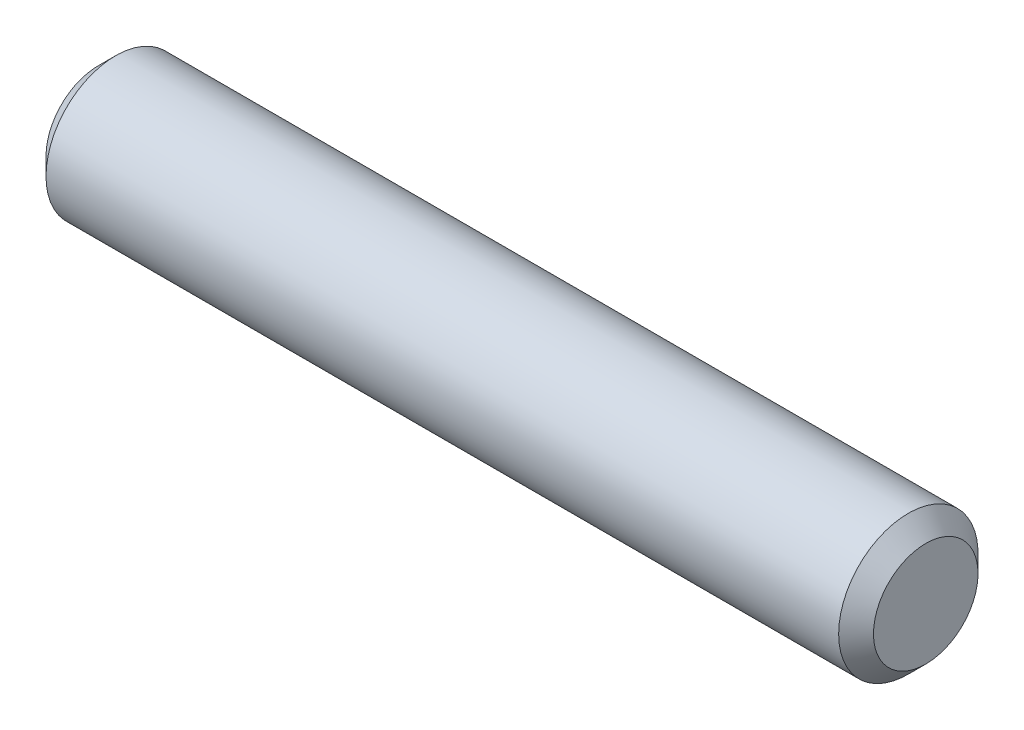
ISO-10303-21;
HEADER;
FILE_DESCRIPTION(('STEP AP214'),'2;1');
FILE_NAME('part.step','',(''),(''),'','','');
FILE_SCHEMA(('AUTOMOTIVE_DESIGN { 1 0 10303 214 1 1 1 1 }'));
ENDSEC;
DATA;
#1=APPLICATION_CONTEXT('core data for automotive mechanical design processes');
#2=APPLICATION_PROTOCOL_DEFINITION('international standard','automotive_design',2000,#1);
#3=PRODUCT_CONTEXT('',#1,'mechanical');
#4=PRODUCT('Part','Part','',(#3));
#5=PRODUCT_RELATED_PRODUCT_CATEGORY('part','',(#4));
#6=PRODUCT_DEFINITION_FORMATION('','',#4);
#7=PRODUCT_DEFINITION_CONTEXT('part definition',#1,'design');
#8=PRODUCT_DEFINITION('design','',#6,#7);
#9=PRODUCT_DEFINITION_SHAPE('','',#8);
#10=(LENGTH_UNIT() NAMED_UNIT(*) SI_UNIT(.MILLI.,.METRE.));
#11=(NAMED_UNIT(*) PLANE_ANGLE_UNIT() SI_UNIT($,.RADIAN.));
#12=(NAMED_UNIT(*) SI_UNIT($,.STERADIAN.) SOLID_ANGLE_UNIT());
#13=UNCERTAINTY_MEASURE_WITH_UNIT(LENGTH_MEASURE(1.E-05),#10,'distance_accuracy_value','');
#14=(GEOMETRIC_REPRESENTATION_CONTEXT(3) GLOBAL_UNCERTAINTY_ASSIGNED_CONTEXT((#13)) GLOBAL_UNIT_ASSIGNED_CONTEXT((#10,
#11,#12)) REPRESENTATION_CONTEXT('',''));
#15=CARTESIAN_POINT('',(0.,0.,0.));
#16=DIRECTION('',(0.,0.,1.));
#17=DIRECTION('',(1.,0.,0.));
#18=AXIS2_PLACEMENT_3D('',#15,#16,#17);
#19=CARTESIAN_POINT('',(-23.75,0.,0.));
#20=DIRECTION('',(1.,0.,0.));
#21=DIRECTION('',(0.,0.,-1.));
#22=AXIS2_PLACEMENT_3D('',#19,#20,#21);
#23=PLANE('',#22);
#24=CARTESIAN_POINT('',(-23.75,0.,0.));
#25=DIRECTION('',(-1.,0.,0.));
#26=DIRECTION('',(0.,0.,1.));
#27=AXIS2_PLACEMENT_3D('',#24,#25,#26);
#28=CIRCLE('',#27,3.);
#29=CARTESIAN_POINT('',(-23.75,0.,3.));
#30=VERTEX_POINT('',#29);
#31=EDGE_CURVE('E10',#30,#30,#28,.T.);
#32=ORIENTED_EDGE('',*,*,#31,.T.);
#33=EDGE_LOOP('',(#32));
#34=FACE_BOUND('',#33,.T.);
#35=ADVANCED_FACE('F30',(#34),#23,.F.);
#36=CARTESIAN_POINT('',(-22.75,0.,0.));
#37=DIRECTION('',(1.,0.,0.));
#38=DIRECTION('',(0.,0.,-1.));
#39=AXIS2_PLACEMENT_3D('',#36,#37,#38);
#40=CONICAL_SURFACE('',#39,4.,0.785398163397448);
#41=ORIENTED_EDGE('',*,*,#31,.F.);
#42=EDGE_LOOP('',(#41));
#43=FACE_BOUND('',#42,.T.);
#44=CARTESIAN_POINT('',(-22.75,0.,0.));
#45=DIRECTION('',(-1.,0.,0.));
#46=DIRECTION('',(0.,0.,1.));
#47=AXIS2_PLACEMENT_3D('',#44,#45,#46);
#48=CIRCLE('',#47,4.);
#49=CARTESIAN_POINT('',(-22.75,0.,4.));
#50=VERTEX_POINT('',#49);
#51=EDGE_CURVE('E36',#50,#50,#48,.T.);
#52=ORIENTED_EDGE('',*,*,#51,.T.);
#53=EDGE_LOOP('',(#52));
#54=FACE_BOUND('',#53,.T.);
#55=ADVANCED_FACE('F62',(#43,#54),#40,.T.);
#56=CARTESIAN_POINT('',(-23.75,0.,0.));
#57=DIRECTION('',(-1.,0.,0.));
#58=DIRECTION('',(0.,0.,1.));
#59=AXIS2_PLACEMENT_3D('',#56,#57,#58);
#60=CYLINDRICAL_SURFACE('',#59,4.);
#61=ORIENTED_EDGE('',*,*,#51,.F.);
#62=EDGE_LOOP('',(#61));
#63=FACE_BOUND('',#62,.T.);
#64=CARTESIAN_POINT('',(22.75,0.,0.));
#65=DIRECTION('',(-1.,0.,0.));
#66=DIRECTION('',(0.,0.,1.));
#67=AXIS2_PLACEMENT_3D('',#64,#65,#66);
#68=CIRCLE('',#67,4.);
#69=CARTESIAN_POINT('',(22.75,0.,4.));
#70=VERTEX_POINT('',#69);
#71=EDGE_CURVE('E40',#70,#70,#68,.T.);
#72=ORIENTED_EDGE('',*,*,#71,.T.);
#73=EDGE_LOOP('',(#72));
#74=FACE_BOUND('',#73,.T.);
#75=ADVANCED_FACE('F58',(#63,#74),#60,.T.);
#76=CARTESIAN_POINT('',(23.75,0.,0.));
#77=DIRECTION('',(-1.,0.,0.));
#78=DIRECTION('',(0.,0.,1.));
#79=AXIS2_PLACEMENT_3D('',#76,#77,#78);
#80=CONICAL_SURFACE('',#79,3.,0.785398163397448);
#81=ORIENTED_EDGE('',*,*,#71,.F.);
#82=EDGE_LOOP('',(#81));
#83=FACE_BOUND('',#82,.T.);
#84=CARTESIAN_POINT('',(23.75,0.,0.));
#85=DIRECTION('',(-1.,0.,0.));
#86=DIRECTION('',(0.,0.,1.));
#87=AXIS2_PLACEMENT_3D('',#84,#85,#86);
#88=CIRCLE('',#87,3.);
#89=CARTESIAN_POINT('',(23.75,0.,3.));
#90=VERTEX_POINT('',#89);
#91=EDGE_CURVE('E44',#90,#90,#88,.T.);
#92=ORIENTED_EDGE('',*,*,#91,.T.);
#93=EDGE_LOOP('',(#92));
#94=FACE_BOUND('',#93,.T.);
#95=ADVANCED_FACE('F50',(#83,#94),#80,.T.);
#96=CARTESIAN_POINT('',(23.75,3.,0.));
#97=DIRECTION('',(-1.,0.,0.));
#98=DIRECTION('',(0.,0.,1.));
#99=AXIS2_PLACEMENT_3D('',#96,#97,#98);
#100=PLANE('',#99);
#101=ORIENTED_EDGE('',*,*,#91,.F.);
#102=EDGE_LOOP('',(#101));
#103=FACE_BOUND('',#102,.T.);
#104=ADVANCED_FACE('F52',(#103),#100,.F.);
#105=CLOSED_SHELL('',(#35,#55,#75,#95,#104));
#106=MANIFOLD_SOLID_BREP('B2',#105);
#107=ADVANCED_BREP_SHAPE_REPRESENTATION('',(#18,#106),#14);
#108=SHAPE_DEFINITION_REPRESENTATION(#9,#107);
ENDSEC;
END-ISO-10303-21;
